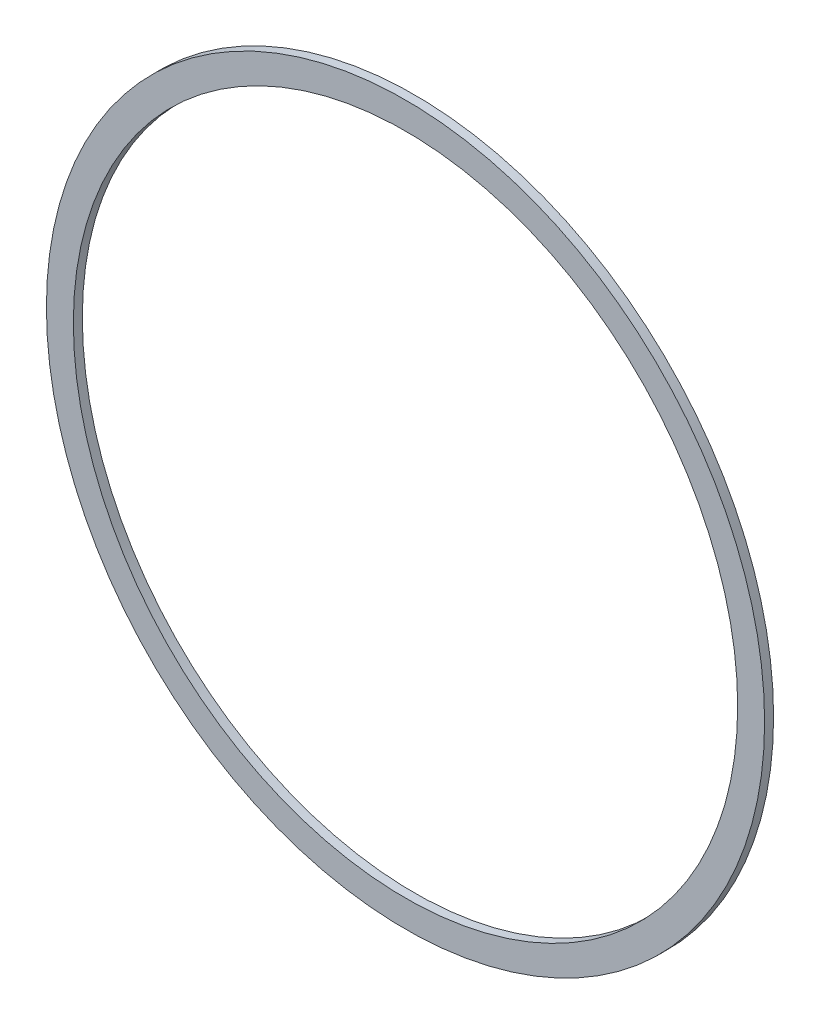
ISO-10303-21;
HEADER;
FILE_DESCRIPTION(('STEP AP214'),'2;1');
FILE_NAME('part.step','',(''),(''),'','','');
FILE_SCHEMA(('AUTOMOTIVE_DESIGN { 1 0 10303 214 1 1 1 1 }'));
ENDSEC;
DATA;
#1=APPLICATION_CONTEXT('core data for automotive mechanical design processes');
#2=APPLICATION_PROTOCOL_DEFINITION('international standard','automotive_design',2000,#1);
#3=PRODUCT_CONTEXT('',#1,'mechanical');
#4=PRODUCT('Part','Part','',(#3));
#5=PRODUCT_RELATED_PRODUCT_CATEGORY('part','',(#4));
#6=PRODUCT_DEFINITION_FORMATION('','',#4);
#7=PRODUCT_DEFINITION_CONTEXT('part definition',#1,'design');
#8=PRODUCT_DEFINITION('design','',#6,#7);
#9=PRODUCT_DEFINITION_SHAPE('','',#8);
#10=(LENGTH_UNIT() NAMED_UNIT(*) SI_UNIT(.MILLI.,.METRE.));
#11=(NAMED_UNIT(*) PLANE_ANGLE_UNIT() SI_UNIT($,.RADIAN.));
#12=(NAMED_UNIT(*) SI_UNIT($,.STERADIAN.) SOLID_ANGLE_UNIT());
#13=UNCERTAINTY_MEASURE_WITH_UNIT(LENGTH_MEASURE(1.E-05),#10,'distance_accuracy_value','');
#14=(GEOMETRIC_REPRESENTATION_CONTEXT(3) GLOBAL_UNCERTAINTY_ASSIGNED_CONTEXT((#13)) GLOBAL_UNIT_ASSIGNED_CONTEXT((#10,
#11,#12)) REPRESENTATION_CONTEXT('',''));
#15=CARTESIAN_POINT('',(0.,0.,0.));
#16=DIRECTION('',(0.,0.,1.));
#17=DIRECTION('',(1.,0.,0.));
#18=AXIS2_PLACEMENT_3D('',#15,#16,#17);
#19=CARTESIAN_POINT('',(0.,0.,1.));
#20=DIRECTION('',(0.,0.,1.));
#21=DIRECTION('',(1.,0.,0.));
#22=AXIS2_PLACEMENT_3D('',#19,#20,#21);
#23=PLANE('',#22);
#24=CARTESIAN_POINT('',(0.,0.,1.));
#25=DIRECTION('',(0.,0.,1.));
#26=DIRECTION('',(1.,0.,0.));
#27=AXIS2_PLACEMENT_3D('',#24,#25,#26);
#28=CIRCLE('',#27,40.);
#29=CARTESIAN_POINT('',(40.,0.,1.));
#30=VERTEX_POINT('',#29);
#31=EDGE_CURVE('E10',#30,#30,#28,.T.);
#32=ORIENTED_EDGE('',*,*,#31,.T.);
#33=EDGE_LOOP('',(#32));
#34=FACE_BOUND('',#33,.T.);
#35=CARTESIAN_POINT('',(0.,0.,1.));
#36=DIRECTION('',(0.,0.,1.));
#37=DIRECTION('',(1.,0.,0.));
#38=AXIS2_PLACEMENT_3D('',#35,#36,#37);
#39=CIRCLE('',#38,37.);
#40=CARTESIAN_POINT('',(37.,0.,1.));
#41=VERTEX_POINT('',#40);
#42=EDGE_CURVE('E42',#41,#41,#39,.T.);
#43=ORIENTED_EDGE('',*,*,#42,.F.);
#44=EDGE_LOOP('',(#43));
#45=FACE_BOUND('',#44,.T.);
#46=ADVANCED_FACE('F31',(#34,#45),#23,.T.);
#47=CARTESIAN_POINT('',(0.,0.,0.));
#48=DIRECTION('',(0.,0.,1.));
#49=DIRECTION('',(1.,0.,0.));
#50=AXIS2_PLACEMENT_3D('',#47,#48,#49);
#51=PLANE('',#50);
#52=CARTESIAN_POINT('',(0.,0.,0.));
#53=DIRECTION('',(0.,0.,1.));
#54=DIRECTION('',(1.,0.,0.));
#55=AXIS2_PLACEMENT_3D('',#52,#53,#54);
#56=CIRCLE('',#55,40.);
#57=CARTESIAN_POINT('',(40.,0.,0.));
#58=VERTEX_POINT('',#57);
#59=EDGE_CURVE('E35',#58,#58,#56,.T.);
#60=ORIENTED_EDGE('',*,*,#59,.F.);
#61=EDGE_LOOP('',(#60));
#62=FACE_BOUND('',#61,.T.);
#63=CARTESIAN_POINT('',(0.,0.,0.));
#64=DIRECTION('',(0.,0.,1.));
#65=DIRECTION('',(1.,0.,0.));
#66=AXIS2_PLACEMENT_3D('',#63,#64,#65);
#67=CIRCLE('',#66,37.);
#68=CARTESIAN_POINT('',(37.,0.,0.));
#69=VERTEX_POINT('',#68);
#70=EDGE_CURVE('E44',#69,#69,#67,.T.);
#71=ORIENTED_EDGE('',*,*,#70,.T.);
#72=EDGE_LOOP('',(#71));
#73=FACE_BOUND('',#72,.T.);
#74=ADVANCED_FACE('F54',(#62,#73),#51,.F.);
#75=CARTESIAN_POINT('',(0.,0.,1.));
#76=DIRECTION('',(0.,0.,-1.));
#77=DIRECTION('',(-1.,0.,0.));
#78=AXIS2_PLACEMENT_3D('',#75,#76,#77);
#79=CYLINDRICAL_SURFACE('',#78,40.);
#80=ORIENTED_EDGE('',*,*,#31,.F.);
#81=EDGE_LOOP('',(#80));
#82=FACE_BOUND('',#81,.T.);
#83=ORIENTED_EDGE('',*,*,#59,.T.);
#84=EDGE_LOOP('',(#83));
#85=FACE_BOUND('',#84,.T.);
#86=ADVANCED_FACE('F33',(#82,#85),#79,.T.);
#87=CARTESIAN_POINT('',(0.,0.,1.));
#88=DIRECTION('',(0.,0.,-1.));
#89=DIRECTION('',(-1.,0.,0.));
#90=AXIS2_PLACEMENT_3D('',#87,#88,#89);
#91=CYLINDRICAL_SURFACE('',#90,37.);
#92=ORIENTED_EDGE('',*,*,#42,.T.);
#93=EDGE_LOOP('',(#92));
#94=FACE_BOUND('',#93,.T.);
#95=ORIENTED_EDGE('',*,*,#70,.F.);
#96=EDGE_LOOP('',(#95));
#97=FACE_BOUND('',#96,.T.);
#98=ADVANCED_FACE('F50',(#94,#97),#91,.F.);
#99=CLOSED_SHELL('',(#46,#74,#86,#98));
#100=MANIFOLD_SOLID_BREP('B2',#99);
#101=ADVANCED_BREP_SHAPE_REPRESENTATION('',(#18,#100),#14);
#102=SHAPE_DEFINITION_REPRESENTATION(#9,#101);
ENDSEC;
END-ISO-10303-21;
